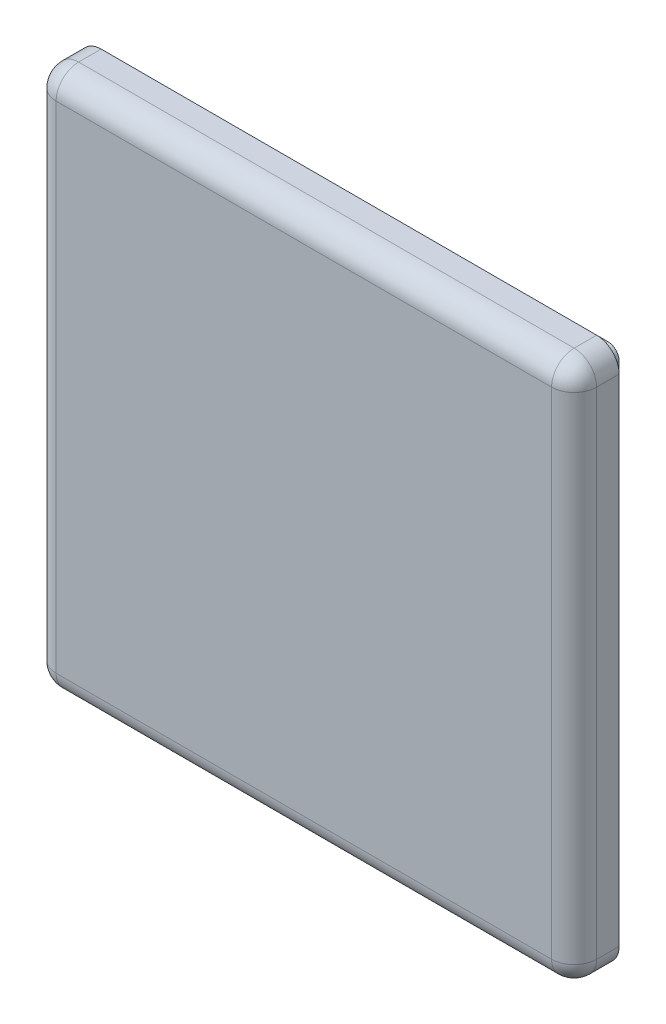
ISO-10303-21;
HEADER;
FILE_DESCRIPTION(('STEP AP214'),'2;1');
FILE_NAME('part.step','',(''),(''),'','','');
FILE_SCHEMA(('AUTOMOTIVE_DESIGN { 1 0 10303 214 1 1 1 1 }'));
ENDSEC;
DATA;
#1=APPLICATION_CONTEXT('core data for automotive mechanical design processes');
#2=APPLICATION_PROTOCOL_DEFINITION('international standard','automotive_design',2000,#1);
#3=PRODUCT_CONTEXT('',#1,'mechanical');
#4=PRODUCT('Part','Part','',(#3));
#5=PRODUCT_RELATED_PRODUCT_CATEGORY('part','',(#4));
#6=PRODUCT_DEFINITION_FORMATION('','',#4);
#7=PRODUCT_DEFINITION_CONTEXT('part definition',#1,'design');
#8=PRODUCT_DEFINITION('design','',#6,#7);
#9=PRODUCT_DEFINITION_SHAPE('','',#8);
#10=(LENGTH_UNIT() NAMED_UNIT(*) SI_UNIT(.MILLI.,.METRE.));
#11=(NAMED_UNIT(*) PLANE_ANGLE_UNIT() SI_UNIT($,.RADIAN.));
#12=(NAMED_UNIT(*) SI_UNIT($,.STERADIAN.) SOLID_ANGLE_UNIT());
#13=UNCERTAINTY_MEASURE_WITH_UNIT(LENGTH_MEASURE(1.E-05),#10,'distance_accuracy_value','');
#14=(GEOMETRIC_REPRESENTATION_CONTEXT(3) GLOBAL_UNCERTAINTY_ASSIGNED_CONTEXT((#13)) GLOBAL_UNIT_ASSIGNED_CONTEXT((#10,
#11,#12)) REPRESENTATION_CONTEXT('',''));
#15=CARTESIAN_POINT('',(0.,0.,0.));
#16=DIRECTION('',(0.,0.,1.));
#17=DIRECTION('',(1.,0.,0.));
#18=AXIS2_PLACEMENT_3D('',#15,#16,#17);
#19=CARTESIAN_POINT('',(0.,0.,0.));
#20=DIRECTION('',(0.,0.,-1.));
#21=DIRECTION('',(-1.,0.,0.));
#22=AXIS2_PLACEMENT_3D('',#19,#20,#21);
#23=PLANE('',#22);
#24=DIRECTION('',(-1.,0.,0.));
#25=VECTOR('',#24,1.);
#26=CARTESIAN_POINT('',(-12.,12.,0.));
#27=LINE('',#26,#25);
#28=CARTESIAN_POINT('',(11.,12.,0.));
#29=VERTEX_POINT('',#28);
#30=CARTESIAN_POINT('',(-11.,12.,0.));
#31=VERTEX_POINT('',#30);
#32=EDGE_CURVE('E254',#29,#31,#27,.T.);
#33=ORIENTED_EDGE('',*,*,#32,.F.);
#34=CARTESIAN_POINT('',(11.,11.,0.));
#35=DIRECTION('',(0.,0.,-1.));
#36=DIRECTION('',(-1.,0.,0.));
#37=AXIS2_PLACEMENT_3D('',#34,#35,#36);
#38=CIRCLE('',#37,1.);
#39=CARTESIAN_POINT('',(12.,11.,0.));
#40=VERTEX_POINT('',#39);
#41=EDGE_CURVE('E317',#29,#40,#38,.T.);
#42=ORIENTED_EDGE('',*,*,#41,.T.);
#43=DIRECTION('',(0.,1.,0.));
#44=VECTOR('',#43,1.);
#45=CARTESIAN_POINT('',(12.,-12.,0.));
#46=LINE('',#45,#44);
#47=CARTESIAN_POINT('',(12.,-11.,0.));
#48=VERTEX_POINT('',#47);
#49=EDGE_CURVE('E242',#48,#40,#46,.T.);
#50=ORIENTED_EDGE('',*,*,#49,.F.);
#51=CARTESIAN_POINT('',(11.,-11.,0.));
#52=DIRECTION('',(0.,0.,-1.));
#53=DIRECTION('',(-1.,0.,0.));
#54=AXIS2_PLACEMENT_3D('',#51,#52,#53);
#55=CIRCLE('',#54,1.);
#56=CARTESIAN_POINT('',(11.,-12.,0.));
#57=VERTEX_POINT('',#56);
#58=EDGE_CURVE('E315',#48,#57,#55,.T.);
#59=ORIENTED_EDGE('',*,*,#58,.T.);
#60=DIRECTION('',(1.,0.,0.));
#61=VECTOR('',#60,1.);
#62=CARTESIAN_POINT('',(-12.,-12.,0.));
#63=LINE('',#62,#61);
#64=CARTESIAN_POINT('',(-11.,-12.,0.));
#65=VERTEX_POINT('',#64);
#66=EDGE_CURVE('E260',#65,#57,#63,.T.);
#67=ORIENTED_EDGE('',*,*,#66,.F.);
#68=CARTESIAN_POINT('',(-11.,-11.,0.));
#69=DIRECTION('',(0.,0.,-1.));
#70=DIRECTION('',(-1.,0.,0.));
#71=AXIS2_PLACEMENT_3D('',#68,#69,#70);
#72=CIRCLE('',#71,1.);
#73=CARTESIAN_POINT('',(-12.,-11.,0.));
#74=VERTEX_POINT('',#73);
#75=EDGE_CURVE('E313',#65,#74,#72,.T.);
#76=ORIENTED_EDGE('',*,*,#75,.T.);
#77=DIRECTION('',(0.,-1.,0.));
#78=VECTOR('',#77,1.);
#79=CARTESIAN_POINT('',(-12.,-12.,0.));
#80=LINE('',#79,#78);
#81=CARTESIAN_POINT('',(-12.,11.,0.));
#82=VERTEX_POINT('',#81);
#83=EDGE_CURVE('E257',#82,#74,#80,.T.);
#84=ORIENTED_EDGE('',*,*,#83,.F.);
#85=CARTESIAN_POINT('',(-11.,11.,0.));
#86=DIRECTION('',(0.,0.,-1.));
#87=DIRECTION('',(-1.,0.,0.));
#88=AXIS2_PLACEMENT_3D('',#85,#86,#87);
#89=CIRCLE('',#88,1.);
#90=EDGE_CURVE('E311',#82,#31,#89,.T.);
#91=ORIENTED_EDGE('',*,*,#90,.T.);
#92=EDGE_LOOP('',(#33,#42,#50,#59,#67,#76,#84,#91));
#93=FACE_BOUND('',#92,.T.);
#94=DIRECTION('',(1.,0.,0.));
#95=VECTOR('',#94,1.);
#96=CARTESIAN_POINT('',(11.,11.,0.));
#97=LINE('',#96,#95);
#98=CARTESIAN_POINT('',(-10.5,11.,0.));
#99=VERTEX_POINT('',#98);
#100=CARTESIAN_POINT('',(10.5,11.,0.));
#101=VERTEX_POINT('',#100);
#102=EDGE_CURVE('E245',#99,#101,#97,.T.);
#103=ORIENTED_EDGE('',*,*,#102,.F.);
#104=CARTESIAN_POINT('',(-10.5,10.5,0.));
#105=DIRECTION('',(0.,0.,-1.));
#106=DIRECTION('',(-1.,0.,0.));
#107=AXIS2_PLACEMENT_3D('',#104,#105,#106);
#108=CIRCLE('',#107,0.5);
#109=CARTESIAN_POINT('',(-11.,10.5,0.));
#110=VERTEX_POINT('',#109);
#111=EDGE_CURVE('E369',#99,#110,#108,.F.);
#112=ORIENTED_EDGE('',*,*,#111,.T.);
#113=DIRECTION('',(0.,1.,0.));
#114=VECTOR('',#113,1.);
#115=CARTESIAN_POINT('',(-11.,11.,0.));
#116=LINE('',#115,#114);
#117=CARTESIAN_POINT('',(-11.,-10.5,0.));
#118=VERTEX_POINT('',#117);
#119=EDGE_CURVE('E205',#118,#110,#116,.T.);
#120=ORIENTED_EDGE('',*,*,#119,.F.);
#121=CARTESIAN_POINT('',(-10.5,-10.5,0.));
#122=DIRECTION('',(0.,0.,-1.));
#123=DIRECTION('',(-1.,0.,0.));
#124=AXIS2_PLACEMENT_3D('',#121,#122,#123);
#125=CIRCLE('',#124,0.5);
#126=CARTESIAN_POINT('',(-10.5,-11.,0.));
#127=VERTEX_POINT('',#126);
#128=EDGE_CURVE('E367',#118,#127,#125,.F.);
#129=ORIENTED_EDGE('',*,*,#128,.T.);
#130=DIRECTION('',(-1.,0.,0.));
#131=VECTOR('',#130,1.);
#132=CARTESIAN_POINT('',(11.,-11.,0.));
#133=LINE('',#132,#131);
#134=CARTESIAN_POINT('',(10.5,-11.,0.));
#135=VERTEX_POINT('',#134);
#136=EDGE_CURVE('E233',#135,#127,#133,.T.);
#137=ORIENTED_EDGE('',*,*,#136,.F.);
#138=CARTESIAN_POINT('',(10.5,-10.5,0.));
#139=DIRECTION('',(0.,0.,-1.));
#140=DIRECTION('',(-1.,0.,0.));
#141=AXIS2_PLACEMENT_3D('',#138,#139,#140);
#142=CIRCLE('',#141,0.5);
#143=CARTESIAN_POINT('',(11.,-10.5,0.));
#144=VERTEX_POINT('',#143);
#145=EDGE_CURVE('E11',#135,#144,#142,.F.);
#146=ORIENTED_EDGE('',*,*,#145,.T.);
#147=DIRECTION('',(0.,-1.,0.));
#148=VECTOR('',#147,1.);
#149=CARTESIAN_POINT('',(11.,11.,0.));
#150=LINE('',#149,#148);
#151=CARTESIAN_POINT('',(11.,10.5,0.));
#152=VERTEX_POINT('',#151);
#153=EDGE_CURVE('E248',#152,#144,#150,.T.);
#154=ORIENTED_EDGE('',*,*,#153,.F.);
#155=CARTESIAN_POINT('',(10.5,10.5,0.));
#156=DIRECTION('',(0.,0.,-1.));
#157=DIRECTION('',(-1.,0.,0.));
#158=AXIS2_PLACEMENT_3D('',#155,#156,#157);
#159=CIRCLE('',#158,0.5);
#160=EDGE_CURVE('E45',#152,#101,#159,.F.);
#161=ORIENTED_EDGE('',*,*,#160,.T.);
#162=EDGE_LOOP('',(#103,#112,#120,#129,#137,#146,#154,#161));
#163=FACE_BOUND('',#162,.T.);
#164=ADVANCED_FACE('F37',(#93,#163),#23,.T.);
#165=CARTESIAN_POINT('',(12.,-12.,2.));
#166=DIRECTION('',(-1.,0.,0.));
#167=DIRECTION('',(0.,0.,1.));
#168=AXIS2_PLACEMENT_3D('',#165,#166,#167);
#169=PLANE('',#168);
#170=ORIENTED_EDGE('',*,*,#49,.T.);
#171=DIRECTION('',(0.,0.,-1.));
#172=VECTOR('',#171,1.);
#173=CARTESIAN_POINT('',(12.,11.,2.));
#174=LINE('',#173,#172);
#175=CARTESIAN_POINT('',(12.,11.,1.));
#176=VERTEX_POINT('',#175);
#177=EDGE_CURVE('E321',#40,#176,#174,.F.);
#178=ORIENTED_EDGE('',*,*,#177,.T.);
#179=DIRECTION('',(0.,1.,0.));
#180=VECTOR('',#179,1.);
#181=CARTESIAN_POINT('',(12.,-12.,1.));
#182=LINE('',#181,#180);
#183=CARTESIAN_POINT('',(12.,-11.,1.));
#184=VERTEX_POINT('',#183);
#185=EDGE_CURVE('E275',#176,#184,#182,.F.);
#186=ORIENTED_EDGE('',*,*,#185,.T.);
#187=DIRECTION('',(0.,0.,-1.));
#188=VECTOR('',#187,1.);
#189=CARTESIAN_POINT('',(12.,-11.,2.));
#190=LINE('',#189,#188);
#191=EDGE_CURVE('E319',#184,#48,#190,.T.);
#192=ORIENTED_EDGE('',*,*,#191,.T.);
#193=EDGE_LOOP('',(#170,#178,#186,#192));
#194=FACE_BOUND('',#193,.T.);
#195=ADVANCED_FACE('F410',(#194),#169,.F.);
#196=CARTESIAN_POINT('',(-12.,12.,2.));
#197=DIRECTION('',(0.,-1.,0.));
#198=DIRECTION('',(0.,0.,-1.));
#199=AXIS2_PLACEMENT_3D('',#196,#197,#198);
#200=PLANE('',#199);
#201=DIRECTION('',(-1.,0.,0.));
#202=VECTOR('',#201,1.);
#203=CARTESIAN_POINT('',(-12.,12.,1.));
#204=LINE('',#203,#202);
#205=CARTESIAN_POINT('',(-11.,12.,1.));
#206=VERTEX_POINT('',#205);
#207=CARTESIAN_POINT('',(11.,12.,1.));
#208=VERTEX_POINT('',#207);
#209=EDGE_CURVE('E284',#206,#208,#204,.F.);
#210=ORIENTED_EDGE('',*,*,#209,.T.);
#211=DIRECTION('',(0.,0.,-1.));
#212=VECTOR('',#211,1.);
#213=CARTESIAN_POINT('',(11.,12.,2.));
#214=LINE('',#213,#212);
#215=EDGE_CURVE('E309',#208,#29,#214,.T.);
#216=ORIENTED_EDGE('',*,*,#215,.T.);
#217=ORIENTED_EDGE('',*,*,#32,.T.);
#218=DIRECTION('',(0.,0.,-1.));
#219=VECTOR('',#218,1.);
#220=CARTESIAN_POINT('',(-11.,12.,2.));
#221=LINE('',#220,#219);
#222=EDGE_CURVE('E307',#31,#206,#221,.F.);
#223=ORIENTED_EDGE('',*,*,#222,.T.);
#224=EDGE_LOOP('',(#210,#216,#217,#223));
#225=FACE_BOUND('',#224,.T.);
#226=ADVANCED_FACE('F417',(#225),#200,.F.);
#227=CARTESIAN_POINT('',(-12.,-12.,2.));
#228=DIRECTION('',(1.,0.,0.));
#229=DIRECTION('',(0.,0.,-1.));
#230=AXIS2_PLACEMENT_3D('',#227,#228,#229);
#231=PLANE('',#230);
#232=ORIENTED_EDGE('',*,*,#83,.T.);
#233=DIRECTION('',(0.,0.,-1.));
#234=VECTOR('',#233,1.);
#235=CARTESIAN_POINT('',(-12.,-11.,2.));
#236=LINE('',#235,#234);
#237=CARTESIAN_POINT('',(-12.,-11.,1.));
#238=VERTEX_POINT('',#237);
#239=EDGE_CURVE('E329',#74,#238,#236,.F.);
#240=ORIENTED_EDGE('',*,*,#239,.T.);
#241=DIRECTION('',(0.,-1.,0.));
#242=VECTOR('',#241,1.);
#243=CARTESIAN_POINT('',(-12.,-12.,1.));
#244=LINE('',#243,#242);
#245=CARTESIAN_POINT('',(-12.,11.,1.));
#246=VERTEX_POINT('',#245);
#247=EDGE_CURVE('E281',#238,#246,#244,.F.);
#248=ORIENTED_EDGE('',*,*,#247,.T.);
#249=DIRECTION('',(0.,0.,-1.));
#250=VECTOR('',#249,1.);
#251=CARTESIAN_POINT('',(-12.,11.,2.));
#252=LINE('',#251,#250);
#253=EDGE_CURVE('E327',#246,#82,#252,.T.);
#254=ORIENTED_EDGE('',*,*,#253,.T.);
#255=EDGE_LOOP('',(#232,#240,#248,#254));
#256=FACE_BOUND('',#255,.T.);
#257=ADVANCED_FACE('F465',(#256),#231,.F.);
#258=CARTESIAN_POINT('',(-12.,-12.,2.));
#259=DIRECTION('',(0.,1.,0.));
#260=DIRECTION('',(0.,0.,1.));
#261=AXIS2_PLACEMENT_3D('',#258,#259,#260);
#262=PLANE('',#261);
#263=ORIENTED_EDGE('',*,*,#66,.T.);
#264=DIRECTION('',(0.,0.,-1.));
#265=VECTOR('',#264,1.);
#266=CARTESIAN_POINT('',(11.,-12.,2.));
#267=LINE('',#266,#265);
#268=CARTESIAN_POINT('',(11.,-12.,1.));
#269=VERTEX_POINT('',#268);
#270=EDGE_CURVE('E325',#57,#269,#267,.F.);
#271=ORIENTED_EDGE('',*,*,#270,.T.);
#272=DIRECTION('',(1.,0.,0.));
#273=VECTOR('',#272,1.);
#274=CARTESIAN_POINT('',(-12.,-12.,1.));
#275=LINE('',#274,#273);
#276=CARTESIAN_POINT('',(-11.,-12.,1.));
#277=VERTEX_POINT('',#276);
#278=EDGE_CURVE('E278',#269,#277,#275,.F.);
#279=ORIENTED_EDGE('',*,*,#278,.T.);
#280=DIRECTION('',(0.,0.,-1.));
#281=VECTOR('',#280,1.);
#282=CARTESIAN_POINT('',(-11.,-12.,2.));
#283=LINE('',#282,#281);
#284=EDGE_CURVE('E323',#277,#65,#283,.T.);
#285=ORIENTED_EDGE('',*,*,#284,.T.);
#286=EDGE_LOOP('',(#263,#271,#279,#285));
#287=FACE_BOUND('',#286,.T.);
#288=ADVANCED_FACE('F460',(#287),#262,.F.);
#289=CARTESIAN_POINT('',(0.,0.,2.));
#290=DIRECTION('',(0.,0.,-1.));
#291=DIRECTION('',(-1.,0.,0.));
#292=AXIS2_PLACEMENT_3D('',#289,#290,#291);
#293=PLANE('',#292);
#294=DIRECTION('',(1.,0.,0.));
#295=VECTOR('',#294,1.);
#296=CARTESIAN_POINT('',(0.,-11.,2.));
#297=LINE('',#296,#295);
#298=CARTESIAN_POINT('',(-11.,-11.,2.));
#299=VERTEX_POINT('',#298);
#300=CARTESIAN_POINT('',(11.,-11.,2.));
#301=VERTEX_POINT('',#300);
#302=EDGE_CURVE('E269',#299,#301,#297,.T.);
#303=ORIENTED_EDGE('',*,*,#302,.T.);
#304=DIRECTION('',(0.,1.,0.));
#305=VECTOR('',#304,1.);
#306=CARTESIAN_POINT('',(11.,0.,2.));
#307=LINE('',#306,#305);
#308=CARTESIAN_POINT('',(11.,11.,2.));
#309=VERTEX_POINT('',#308);
#310=EDGE_CURVE('E272',#301,#309,#307,.T.);
#311=ORIENTED_EDGE('',*,*,#310,.T.);
#312=DIRECTION('',(-1.,0.,0.));
#313=VECTOR('',#312,1.);
#314=CARTESIAN_POINT('',(0.,11.,2.));
#315=LINE('',#314,#313);
#316=CARTESIAN_POINT('',(-11.,11.,2.));
#317=VERTEX_POINT('',#316);
#318=EDGE_CURVE('E263',#309,#317,#315,.T.);
#319=ORIENTED_EDGE('',*,*,#318,.T.);
#320=DIRECTION('',(0.,-1.,0.));
#321=VECTOR('',#320,1.);
#322=CARTESIAN_POINT('',(-11.,0.,2.));
#323=LINE('',#322,#321);
#324=EDGE_CURVE('E266',#317,#299,#323,.T.);
#325=ORIENTED_EDGE('',*,*,#324,.T.);
#326=EDGE_LOOP('',(#303,#311,#319,#325));
#327=FACE_BOUND('',#326,.T.);
#328=ADVANCED_FACE('F451',(#327),#293,.F.);
#329=CARTESIAN_POINT('',(0.,0.,-1.));
#330=DIRECTION('',(0.,0.,-1.));
#331=DIRECTION('',(-1.,0.,0.));
#332=AXIS2_PLACEMENT_3D('',#329,#330,#331);
#333=PLANE('',#332);
#334=DIRECTION('',(-1.,0.,0.));
#335=VECTOR('',#334,1.);
#336=CARTESIAN_POINT('',(11.,-11.,-1.));
#337=LINE('',#336,#335);
#338=CARTESIAN_POINT('',(10.5,-11.,-1.));
#339=VERTEX_POINT('',#338);
#340=CARTESIAN_POINT('',(-10.5,-11.,-1.));
#341=VERTEX_POINT('',#340);
#342=EDGE_CURVE('E239',#339,#341,#337,.T.);
#343=ORIENTED_EDGE('',*,*,#342,.T.);
#344=CARTESIAN_POINT('',(-10.5,-10.5,-1.));
#345=DIRECTION('',(0.,0.,-1.));
#346=DIRECTION('',(-1.,0.,0.));
#347=AXIS2_PLACEMENT_3D('',#344,#345,#346);
#348=CIRCLE('',#347,0.5);
#349=CARTESIAN_POINT('',(-11.,-10.5,-1.));
#350=VERTEX_POINT('',#349);
#351=EDGE_CURVE('E356',#341,#350,#348,.T.);
#352=ORIENTED_EDGE('',*,*,#351,.T.);
#353=DIRECTION('',(0.,1.,0.));
#354=VECTOR('',#353,1.);
#355=CARTESIAN_POINT('',(-11.,11.,-1.));
#356=LINE('',#355,#354);
#357=CARTESIAN_POINT('',(-11.,10.5,-1.));
#358=VERTEX_POINT('',#357);
#359=EDGE_CURVE('E229',#350,#358,#356,.T.);
#360=ORIENTED_EDGE('',*,*,#359,.T.);
#361=CARTESIAN_POINT('',(-10.5,10.5,-1.));
#362=DIRECTION('',(0.,0.,-1.));
#363=DIRECTION('',(-1.,0.,0.));
#364=AXIS2_PLACEMENT_3D('',#361,#362,#363);
#365=CIRCLE('',#364,0.5);
#366=CARTESIAN_POINT('',(-10.5,11.,-1.));
#367=VERTEX_POINT('',#366);
#368=EDGE_CURVE('E354',#358,#367,#365,.T.);
#369=ORIENTED_EDGE('',*,*,#368,.T.);
#370=DIRECTION('',(1.,0.,0.));
#371=VECTOR('',#370,1.);
#372=CARTESIAN_POINT('',(11.,11.,-1.));
#373=LINE('',#372,#371);
#374=CARTESIAN_POINT('',(10.5,11.,-1.));
#375=VERTEX_POINT('',#374);
#376=EDGE_CURVE('E232',#367,#375,#373,.T.);
#377=ORIENTED_EDGE('',*,*,#376,.T.);
#378=CARTESIAN_POINT('',(10.5,10.5,-1.));
#379=DIRECTION('',(0.,0.,-1.));
#380=DIRECTION('',(-1.,0.,0.));
#381=AXIS2_PLACEMENT_3D('',#378,#379,#380);
#382=CIRCLE('',#381,0.5);
#383=CARTESIAN_POINT('',(11.,10.5,-1.));
#384=VERTEX_POINT('',#383);
#385=EDGE_CURVE('E352',#375,#384,#382,.T.);
#386=ORIENTED_EDGE('',*,*,#385,.T.);
#387=DIRECTION('',(0.,-1.,0.));
#388=VECTOR('',#387,1.);
#389=CARTESIAN_POINT('',(11.,11.,-1.));
#390=LINE('',#389,#388);
#391=CARTESIAN_POINT('',(11.,-10.5,-1.));
#392=VERTEX_POINT('',#391);
#393=EDGE_CURVE('E236',#384,#392,#390,.T.);
#394=ORIENTED_EDGE('',*,*,#393,.T.);
#395=CARTESIAN_POINT('',(10.5,-10.5,-1.));
#396=DIRECTION('',(0.,0.,-1.));
#397=DIRECTION('',(-1.,0.,0.));
#398=AXIS2_PLACEMENT_3D('',#395,#396,#397);
#399=CIRCLE('',#398,0.5);
#400=EDGE_CURVE('E350',#392,#339,#399,.T.);
#401=ORIENTED_EDGE('',*,*,#400,.T.);
#402=EDGE_LOOP('',(#343,#352,#360,#369,#377,#386,#394,#401));
#403=FACE_BOUND('',#402,.T.);
#404=DIRECTION('',(1.,0.,0.));
#405=VECTOR('',#404,1.);
#406=CARTESIAN_POINT('',(10.,10.,-1.));
#407=LINE('',#406,#405);
#408=CARTESIAN_POINT('',(-10.,10.,-1.));
#409=VERTEX_POINT('',#408);
#410=CARTESIAN_POINT('',(10.,10.,-1.));
#411=VERTEX_POINT('',#410);
#412=EDGE_CURVE('E196',#409,#411,#407,.T.);
#413=ORIENTED_EDGE('',*,*,#412,.F.);
#414=DIRECTION('',(0.,1.,0.));
#415=VECTOR('',#414,1.);
#416=CARTESIAN_POINT('',(-10.,10.,-1.));
#417=LINE('',#416,#415);
#418=CARTESIAN_POINT('',(-10.,-10.,-1.));
#419=VERTEX_POINT('',#418);
#420=EDGE_CURVE('E186',#419,#409,#417,.T.);
#421=ORIENTED_EDGE('',*,*,#420,.F.);
#422=DIRECTION('',(-1.,0.,0.));
#423=VECTOR('',#422,1.);
#424=CARTESIAN_POINT('',(10.,-10.,-1.));
#425=LINE('',#424,#423);
#426=CARTESIAN_POINT('',(10.,-10.,-1.));
#427=VERTEX_POINT('',#426);
#428=EDGE_CURVE('E213',#427,#419,#425,.T.);
#429=ORIENTED_EDGE('',*,*,#428,.F.);
#430=DIRECTION('',(0.,-1.,0.));
#431=VECTOR('',#430,1.);
#432=CARTESIAN_POINT('',(10.,10.,-1.));
#433=LINE('',#432,#431);
#434=EDGE_CURVE('E211',#411,#427,#433,.T.);
#435=ORIENTED_EDGE('',*,*,#434,.F.);
#436=EDGE_LOOP('',(#413,#421,#429,#435));
#437=FACE_BOUND('',#436,.T.);
#438=ADVANCED_FACE('F209',(#403,#437),#333,.T.);
#439=CARTESIAN_POINT('',(-11.,11.,-1.));
#440=DIRECTION('',(1.,0.,0.));
#441=DIRECTION('',(0.,1.,0.));
#442=AXIS2_PLACEMENT_3D('',#439,#440,#441);
#443=PLANE('',#442);
#444=ORIENTED_EDGE('',*,*,#359,.F.);
#445=DIRECTION('',(0.,0.,1.));
#446=VECTOR('',#445,1.);
#447=CARTESIAN_POINT('',(-11.,-10.5,-1.));
#448=LINE('',#447,#446);
#449=EDGE_CURVE('E342',#350,#118,#448,.T.);
#450=ORIENTED_EDGE('',*,*,#449,.T.);
#451=ORIENTED_EDGE('',*,*,#119,.T.);
#452=DIRECTION('',(0.,0.,1.));
#453=VECTOR('',#452,1.);
#454=CARTESIAN_POINT('',(-11.,10.5,-1.));
#455=LINE('',#454,#453);
#456=EDGE_CURVE('E331',#110,#358,#455,.F.);
#457=ORIENTED_EDGE('',*,*,#456,.T.);
#458=EDGE_LOOP('',(#444,#450,#451,#457));
#459=FACE_BOUND('',#458,.T.);
#460=ADVANCED_FACE('F396',(#459),#443,.F.);
#461=CARTESIAN_POINT('',(11.,11.,-1.));
#462=DIRECTION('',(0.,-1.,0.));
#463=DIRECTION('',(0.,0.,-1.));
#464=AXIS2_PLACEMENT_3D('',#461,#462,#463);
#465=PLANE('',#464);
#466=ORIENTED_EDGE('',*,*,#376,.F.);
#467=DIRECTION('',(0.,0.,1.));
#468=VECTOR('',#467,1.);
#469=CARTESIAN_POINT('',(-10.5,11.,-1.));
#470=LINE('',#469,#468);
#471=EDGE_CURVE('E360',#367,#99,#470,.T.);
#472=ORIENTED_EDGE('',*,*,#471,.T.);
#473=ORIENTED_EDGE('',*,*,#102,.T.);
#474=DIRECTION('',(0.,0.,1.));
#475=VECTOR('',#474,1.);
#476=CARTESIAN_POINT('',(10.5,11.,-1.));
#477=LINE('',#476,#475);
#478=EDGE_CURVE('E358',#101,#375,#477,.F.);
#479=ORIENTED_EDGE('',*,*,#478,.T.);
#480=EDGE_LOOP('',(#466,#472,#473,#479));
#481=FACE_BOUND('',#480,.T.);
#482=ADVANCED_FACE('F373',(#481),#465,.F.);
#483=CARTESIAN_POINT('',(11.,11.,-1.));
#484=DIRECTION('',(-1.,0.,0.));
#485=DIRECTION('',(0.,-1.,0.));
#486=AXIS2_PLACEMENT_3D('',#483,#484,#485);
#487=PLANE('',#486);
#488=ORIENTED_EDGE('',*,*,#393,.F.);
#489=DIRECTION('',(0.,0.,1.));
#490=VECTOR('',#489,1.);
#491=CARTESIAN_POINT('',(11.,10.5,-1.));
#492=LINE('',#491,#490);
#493=EDGE_CURVE('E365',#384,#152,#492,.T.);
#494=ORIENTED_EDGE('',*,*,#493,.T.);
#495=ORIENTED_EDGE('',*,*,#153,.T.);
#496=DIRECTION('',(0.,0.,1.));
#497=VECTOR('',#496,1.);
#498=CARTESIAN_POINT('',(11.,-10.5,-1.));
#499=LINE('',#498,#497);
#500=EDGE_CURVE('E363',#144,#392,#499,.F.);
#501=ORIENTED_EDGE('',*,*,#500,.T.);
#502=EDGE_LOOP('',(#488,#494,#495,#501));
#503=FACE_BOUND('',#502,.T.);
#504=ADVANCED_FACE('F381',(#503),#487,.F.);
#505=CARTESIAN_POINT('',(11.,-11.,-1.));
#506=DIRECTION('',(0.,1.,0.));
#507=DIRECTION('',(0.,0.,1.));
#508=AXIS2_PLACEMENT_3D('',#505,#506,#507);
#509=PLANE('',#508);
#510=ORIENTED_EDGE('',*,*,#136,.T.);
#511=DIRECTION('',(0.,0.,1.));
#512=VECTOR('',#511,1.);
#513=CARTESIAN_POINT('',(-10.5,-11.,-1.));
#514=LINE('',#513,#512);
#515=EDGE_CURVE('E348',#127,#341,#514,.F.);
#516=ORIENTED_EDGE('',*,*,#515,.T.);
#517=ORIENTED_EDGE('',*,*,#342,.F.);
#518=DIRECTION('',(0.,0.,1.));
#519=VECTOR('',#518,1.);
#520=CARTESIAN_POINT('',(10.5,-11.,-1.));
#521=LINE('',#520,#519);
#522=EDGE_CURVE('E345',#339,#135,#521,.T.);
#523=ORIENTED_EDGE('',*,*,#522,.T.);
#524=EDGE_LOOP('',(#510,#516,#517,#523));
#525=FACE_BOUND('',#524,.T.);
#526=ADVANCED_FACE('F388',(#525),#509,.F.);
#527=CARTESIAN_POINT('',(-10.,10.,-1.));
#528=DIRECTION('',(1.,0.,0.));
#529=DIRECTION('',(0.,1.,0.));
#530=AXIS2_PLACEMENT_3D('',#527,#528,#529);
#531=PLANE('',#530);
#532=DIRECTION('',(0.,1.,0.));
#533=VECTOR('',#532,1.);
#534=CARTESIAN_POINT('',(-10.,10.,0.));
#535=LINE('',#534,#533);
#536=CARTESIAN_POINT('',(-10.,-10.,0.));
#537=VERTEX_POINT('',#536);
#538=CARTESIAN_POINT('',(-10.,10.,0.));
#539=VERTEX_POINT('',#538);
#540=EDGE_CURVE('E217',#537,#539,#535,.T.);
#541=ORIENTED_EDGE('',*,*,#540,.F.);
#542=DIRECTION('',(0.,0.,1.));
#543=VECTOR('',#542,1.);
#544=CARTESIAN_POINT('',(-10.,-10.,-1.));
#545=LINE('',#544,#543);
#546=EDGE_CURVE('E192',#419,#537,#545,.T.);
#547=ORIENTED_EDGE('',*,*,#546,.F.);
#548=ORIENTED_EDGE('',*,*,#420,.T.);
#549=DIRECTION('',(0.,0.,1.));
#550=VECTOR('',#549,1.);
#551=CARTESIAN_POINT('',(-10.,10.,-1.));
#552=LINE('',#551,#550);
#553=EDGE_CURVE('E190',#409,#539,#552,.T.);
#554=ORIENTED_EDGE('',*,*,#553,.T.);
#555=EDGE_LOOP('',(#541,#547,#548,#554));
#556=FACE_BOUND('',#555,.T.);
#557=ADVANCED_FACE('F189',(#556),#531,.T.);
#558=CARTESIAN_POINT('',(10.,10.,-1.));
#559=DIRECTION('',(0.,-1.,0.));
#560=DIRECTION('',(0.,0.,-1.));
#561=AXIS2_PLACEMENT_3D('',#558,#559,#560);
#562=PLANE('',#561);
#563=DIRECTION('',(1.,0.,0.));
#564=VECTOR('',#563,1.);
#565=CARTESIAN_POINT('',(10.,10.,0.));
#566=LINE('',#565,#564);
#567=CARTESIAN_POINT('',(10.,10.,0.));
#568=VERTEX_POINT('',#567);
#569=EDGE_CURVE('E204',#539,#568,#566,.T.);
#570=ORIENTED_EDGE('',*,*,#569,.F.);
#571=ORIENTED_EDGE('',*,*,#553,.F.);
#572=ORIENTED_EDGE('',*,*,#412,.T.);
#573=DIRECTION('',(0.,0.,1.));
#574=VECTOR('',#573,1.);
#575=CARTESIAN_POINT('',(10.,10.,-1.));
#576=LINE('',#575,#574);
#577=EDGE_CURVE('E206',#411,#568,#576,.T.);
#578=ORIENTED_EDGE('',*,*,#577,.T.);
#579=EDGE_LOOP('',(#570,#571,#572,#578));
#580=FACE_BOUND('',#579,.T.);
#581=ADVANCED_FACE('F201',(#580),#562,.T.);
#582=CARTESIAN_POINT('',(10.,10.,-1.));
#583=DIRECTION('',(-1.,0.,0.));
#584=DIRECTION('',(0.,-1.,0.));
#585=AXIS2_PLACEMENT_3D('',#582,#583,#584);
#586=PLANE('',#585);
#587=DIRECTION('',(0.,-1.,0.));
#588=VECTOR('',#587,1.);
#589=CARTESIAN_POINT('',(10.,10.,0.));
#590=LINE('',#589,#588);
#591=CARTESIAN_POINT('',(10.,-10.,0.));
#592=VERTEX_POINT('',#591);
#593=EDGE_CURVE('E221',#568,#592,#590,.T.);
#594=ORIENTED_EDGE('',*,*,#593,.F.);
#595=ORIENTED_EDGE('',*,*,#577,.F.);
#596=ORIENTED_EDGE('',*,*,#434,.T.);
#597=DIRECTION('',(0.,0.,1.));
#598=VECTOR('',#597,1.);
#599=CARTESIAN_POINT('',(10.,-10.,-1.));
#600=LINE('',#599,#598);
#601=EDGE_CURVE('E225',#427,#592,#600,.T.);
#602=ORIENTED_EDGE('',*,*,#601,.T.);
#603=EDGE_LOOP('',(#594,#595,#596,#602));
#604=FACE_BOUND('',#603,.T.);
#605=ADVANCED_FACE('F434',(#604),#586,.T.);
#606=CARTESIAN_POINT('',(10.,-10.,-1.));
#607=DIRECTION('',(0.,1.,0.));
#608=DIRECTION('',(0.,0.,1.));
#609=AXIS2_PLACEMENT_3D('',#606,#607,#608);
#610=PLANE('',#609);
#611=DIRECTION('',(-1.,0.,0.));
#612=VECTOR('',#611,1.);
#613=CARTESIAN_POINT('',(10.,-10.,0.));
#614=LINE('',#613,#612);
#615=EDGE_CURVE('E197',#592,#537,#614,.T.);
#616=ORIENTED_EDGE('',*,*,#615,.F.);
#617=ORIENTED_EDGE('',*,*,#601,.F.);
#618=ORIENTED_EDGE('',*,*,#428,.T.);
#619=ORIENTED_EDGE('',*,*,#546,.T.);
#620=EDGE_LOOP('',(#616,#617,#618,#619));
#621=FACE_BOUND('',#620,.T.);
#622=ADVANCED_FACE('F425',(#621),#610,.T.);
#623=ORIENTED_EDGE('',*,*,#540,.T.);
#624=ORIENTED_EDGE('',*,*,#569,.T.);
#625=ORIENTED_EDGE('',*,*,#593,.T.);
#626=ORIENTED_EDGE('',*,*,#615,.T.);
#627=EDGE_LOOP('',(#623,#624,#625,#626));
#628=FACE_BOUND('',#627,.T.);
#629=ADVANCED_FACE('F413',(#628),#23,.T.);
#630=CARTESIAN_POINT('',(-11.,0.,1.));
#631=DIRECTION('',(0.,-1.,0.));
#632=DIRECTION('',(0.,0.,-1.));
#633=AXIS2_PLACEMENT_3D('',#630,#631,#632);
#634=CYLINDRICAL_SURFACE('',#633,1.);
#635=ORIENTED_EDGE('',*,*,#247,.F.);
#636=CARTESIAN_POINT('',(-11.,-11.,1.));
#637=DIRECTION('',(0.,-1.,0.));
#638=DIRECTION('',(0.,0.,-1.));
#639=AXIS2_PLACEMENT_3D('',#636,#637,#638);
#640=CIRCLE('',#639,1.);
#641=EDGE_CURVE('E305',#238,#299,#640,.F.);
#642=ORIENTED_EDGE('',*,*,#641,.T.);
#643=ORIENTED_EDGE('',*,*,#324,.F.);
#644=CARTESIAN_POINT('',(-11.,11.,1.));
#645=DIRECTION('',(0.,-1.,0.));
#646=DIRECTION('',(0.,0.,-1.));
#647=AXIS2_PLACEMENT_3D('',#644,#645,#646);
#648=CIRCLE('',#647,1.);
#649=EDGE_CURVE('E303',#317,#246,#648,.T.);
#650=ORIENTED_EDGE('',*,*,#649,.T.);
#651=EDGE_LOOP('',(#635,#642,#643,#650));
#652=FACE_BOUND('',#651,.T.);
#653=ADVANCED_FACE('F424',(#652),#634,.T.);
#654=CARTESIAN_POINT('',(0.,-11.,1.));
#655=DIRECTION('',(1.,0.,0.));
#656=DIRECTION('',(0.,0.,-1.));
#657=AXIS2_PLACEMENT_3D('',#654,#655,#656);
#658=CYLINDRICAL_SURFACE('',#657,1.);
#659=ORIENTED_EDGE('',*,*,#278,.F.);
#660=CARTESIAN_POINT('',(11.,-11.,1.));
#661=DIRECTION('',(1.,0.,0.));
#662=DIRECTION('',(0.,0.,-1.));
#663=AXIS2_PLACEMENT_3D('',#660,#661,#662);
#664=CIRCLE('',#663,1.);
#665=EDGE_CURVE('E301',#269,#301,#664,.F.);
#666=ORIENTED_EDGE('',*,*,#665,.T.);
#667=ORIENTED_EDGE('',*,*,#302,.F.);
#668=CARTESIAN_POINT('',(-11.,-11.,1.));
#669=DIRECTION('',(1.,0.,0.));
#670=DIRECTION('',(0.,0.,-1.));
#671=AXIS2_PLACEMENT_3D('',#668,#669,#670);
#672=CIRCLE('',#671,1.);
#673=EDGE_CURVE('E298',#299,#277,#672,.T.);
#674=ORIENTED_EDGE('',*,*,#673,.T.);
#675=EDGE_LOOP('',(#659,#666,#667,#674));
#676=FACE_BOUND('',#675,.T.);
#677=ADVANCED_FACE('F431',(#676),#658,.T.);
#678=CARTESIAN_POINT('',(0.,11.,1.));
#679=DIRECTION('',(-1.,0.,0.));
#680=DIRECTION('',(0.,0.,1.));
#681=AXIS2_PLACEMENT_3D('',#678,#679,#680);
#682=CYLINDRICAL_SURFACE('',#681,1.);
#683=ORIENTED_EDGE('',*,*,#318,.F.);
#684=CARTESIAN_POINT('',(11.,11.,1.));
#685=DIRECTION('',(-1.,0.,0.));
#686=DIRECTION('',(0.,0.,1.));
#687=AXIS2_PLACEMENT_3D('',#684,#685,#686);
#688=CIRCLE('',#687,1.);
#689=EDGE_CURVE('E296',#309,#208,#688,.T.);
#690=ORIENTED_EDGE('',*,*,#689,.T.);
#691=ORIENTED_EDGE('',*,*,#209,.F.);
#692=CARTESIAN_POINT('',(-11.,11.,1.));
#693=DIRECTION('',(-1.,0.,0.));
#694=DIRECTION('',(0.,0.,1.));
#695=AXIS2_PLACEMENT_3D('',#692,#693,#694);
#696=CIRCLE('',#695,1.);
#697=EDGE_CURVE('E293',#206,#317,#696,.F.);
#698=ORIENTED_EDGE('',*,*,#697,.T.);
#699=EDGE_LOOP('',(#683,#690,#691,#698));
#700=FACE_BOUND('',#699,.T.);
#701=ADVANCED_FACE('F499',(#700),#682,.T.);
#702=CARTESIAN_POINT('',(11.,0.,1.));
#703=DIRECTION('',(0.,1.,0.));
#704=DIRECTION('',(0.,0.,1.));
#705=AXIS2_PLACEMENT_3D('',#702,#703,#704);
#706=CYLINDRICAL_SURFACE('',#705,1.);
#707=ORIENTED_EDGE('',*,*,#185,.F.);
#708=CARTESIAN_POINT('',(11.,11.,1.));
#709=DIRECTION('',(0.,1.,0.));
#710=DIRECTION('',(0.,0.,1.));
#711=AXIS2_PLACEMENT_3D('',#708,#709,#710);
#712=CIRCLE('',#711,1.);
#713=EDGE_CURVE('E290',#176,#309,#712,.F.);
#714=ORIENTED_EDGE('',*,*,#713,.T.);
#715=ORIENTED_EDGE('',*,*,#310,.F.);
#716=CARTESIAN_POINT('',(11.,-11.,1.));
#717=DIRECTION('',(0.,1.,0.));
#718=DIRECTION('',(0.,0.,1.));
#719=AXIS2_PLACEMENT_3D('',#716,#717,#718);
#720=CIRCLE('',#719,1.);
#721=EDGE_CURVE('E287',#301,#184,#720,.T.);
#722=ORIENTED_EDGE('',*,*,#721,.T.);
#723=EDGE_LOOP('',(#707,#714,#715,#722));
#724=FACE_BOUND('',#723,.T.);
#725=ADVANCED_FACE('F475',(#724),#706,.T.);
#726=CARTESIAN_POINT('',(11.,11.,2.));
#727=DIRECTION('',(0.,0.,-1.));
#728=DIRECTION('',(-1.,0.,0.));
#729=AXIS2_PLACEMENT_3D('',#726,#727,#728);
#730=CYLINDRICAL_SURFACE('',#729,1.);
#731=ORIENTED_EDGE('',*,*,#41,.F.);
#732=ORIENTED_EDGE('',*,*,#215,.F.);
#733=CARTESIAN_POINT('',(11.,11.,1.));
#734=DIRECTION('',(0.,0.,1.));
#735=DIRECTION('',(1.,0.,0.));
#736=AXIS2_PLACEMENT_3D('',#733,#734,#735);
#737=CIRCLE('',#736,1.);
#738=EDGE_CURVE('E219',#176,#208,#737,.T.);
#739=ORIENTED_EDGE('',*,*,#738,.F.);
#740=ORIENTED_EDGE('',*,*,#177,.F.);
#741=EDGE_LOOP('',(#731,#732,#739,#740));
#742=FACE_BOUND('',#741,.T.);
#743=ADVANCED_FACE('F493',(#742),#730,.T.);
#744=CARTESIAN_POINT('',(11.,11.,1.));
#745=DIRECTION('',(0.,0.,1.));
#746=DIRECTION('',(1.,0.,0.));
#747=AXIS2_PLACEMENT_3D('',#744,#745,#746);
#748=SPHERICAL_SURFACE('',#747,1.);
#749=ORIENTED_EDGE('',*,*,#738,.T.);
#750=ORIENTED_EDGE('',*,*,#689,.F.);
#751=ORIENTED_EDGE('',*,*,#713,.F.);
#752=EDGE_LOOP('',(#749,#750,#751));
#753=FACE_BOUND('',#752,.T.);
#754=ADVANCED_FACE('F496',(#753),#748,.T.);
#755=CARTESIAN_POINT('',(11.,-11.,2.));
#756=DIRECTION('',(0.,0.,-1.));
#757=DIRECTION('',(-1.,0.,0.));
#758=AXIS2_PLACEMENT_3D('',#755,#756,#757);
#759=CYLINDRICAL_SURFACE('',#758,1.);
#760=ORIENTED_EDGE('',*,*,#58,.F.);
#761=ORIENTED_EDGE('',*,*,#191,.F.);
#762=CARTESIAN_POINT('',(11.,-11.,1.));
#763=DIRECTION('',(0.,0.,1.));
#764=DIRECTION('',(1.,0.,0.));
#765=AXIS2_PLACEMENT_3D('',#762,#763,#764);
#766=CIRCLE('',#765,1.);
#767=EDGE_CURVE('E334',#269,#184,#766,.T.);
#768=ORIENTED_EDGE('',*,*,#767,.F.);
#769=ORIENTED_EDGE('',*,*,#270,.F.);
#770=EDGE_LOOP('',(#760,#761,#768,#769));
#771=FACE_BOUND('',#770,.T.);
#772=ADVANCED_FACE('F486',(#771),#759,.T.);
#773=CARTESIAN_POINT('',(11.,-11.,1.));
#774=DIRECTION('',(0.,0.,1.));
#775=DIRECTION('',(1.,0.,0.));
#776=AXIS2_PLACEMENT_3D('',#773,#774,#775);
#777=SPHERICAL_SURFACE('',#776,1.);
#778=ORIENTED_EDGE('',*,*,#721,.F.);
#779=ORIENTED_EDGE('',*,*,#665,.F.);
#780=ORIENTED_EDGE('',*,*,#767,.T.);
#781=EDGE_LOOP('',(#778,#779,#780));
#782=FACE_BOUND('',#781,.T.);
#783=ADVANCED_FACE('F480',(#782),#777,.T.);
#784=CARTESIAN_POINT('',(-11.,-11.,2.));
#785=DIRECTION('',(0.,0.,-1.));
#786=DIRECTION('',(-1.,0.,0.));
#787=AXIS2_PLACEMENT_3D('',#784,#785,#786);
#788=CYLINDRICAL_SURFACE('',#787,1.);
#789=ORIENTED_EDGE('',*,*,#75,.F.);
#790=ORIENTED_EDGE('',*,*,#284,.F.);
#791=CARTESIAN_POINT('',(-11.,-11.,1.));
#792=DIRECTION('',(0.,0.,1.));
#793=DIRECTION('',(1.,0.,0.));
#794=AXIS2_PLACEMENT_3D('',#791,#792,#793);
#795=CIRCLE('',#794,1.);
#796=EDGE_CURVE('E336',#238,#277,#795,.T.);
#797=ORIENTED_EDGE('',*,*,#796,.F.);
#798=ORIENTED_EDGE('',*,*,#239,.F.);
#799=EDGE_LOOP('',(#789,#790,#797,#798));
#800=FACE_BOUND('',#799,.T.);
#801=ADVANCED_FACE('F518',(#800),#788,.T.);
#802=CARTESIAN_POINT('',(-11.,-11.,1.));
#803=DIRECTION('',(0.,0.,1.));
#804=DIRECTION('',(1.,0.,0.));
#805=AXIS2_PLACEMENT_3D('',#802,#803,#804);
#806=SPHERICAL_SURFACE('',#805,1.);
#807=ORIENTED_EDGE('',*,*,#673,.F.);
#808=ORIENTED_EDGE('',*,*,#641,.F.);
#809=ORIENTED_EDGE('',*,*,#796,.T.);
#810=EDGE_LOOP('',(#807,#808,#809));
#811=FACE_BOUND('',#810,.T.);
#812=ADVANCED_FACE('F513',(#811),#806,.T.);
#813=CARTESIAN_POINT('',(-11.,11.,2.));
#814=DIRECTION('',(0.,0.,-1.));
#815=DIRECTION('',(-1.,0.,0.));
#816=AXIS2_PLACEMENT_3D('',#813,#814,#815);
#817=CYLINDRICAL_SURFACE('',#816,1.);
#818=ORIENTED_EDGE('',*,*,#90,.F.);
#819=ORIENTED_EDGE('',*,*,#253,.F.);
#820=CARTESIAN_POINT('',(-11.,11.,1.));
#821=DIRECTION('',(0.,0.,1.));
#822=DIRECTION('',(1.,0.,0.));
#823=AXIS2_PLACEMENT_3D('',#820,#821,#822);
#824=CIRCLE('',#823,1.);
#825=EDGE_CURVE('E338',#206,#246,#824,.T.);
#826=ORIENTED_EDGE('',*,*,#825,.F.);
#827=ORIENTED_EDGE('',*,*,#222,.F.);
#828=EDGE_LOOP('',(#818,#819,#826,#827));
#829=FACE_BOUND('',#828,.T.);
#830=ADVANCED_FACE('F505',(#829),#817,.T.);
#831=CARTESIAN_POINT('',(-11.,11.,1.));
#832=DIRECTION('',(0.,0.,1.));
#833=DIRECTION('',(1.,0.,0.));
#834=AXIS2_PLACEMENT_3D('',#831,#832,#833);
#835=SPHERICAL_SURFACE('',#834,1.);
#836=ORIENTED_EDGE('',*,*,#825,.T.);
#837=ORIENTED_EDGE('',*,*,#649,.F.);
#838=ORIENTED_EDGE('',*,*,#697,.F.);
#839=EDGE_LOOP('',(#836,#837,#838));
#840=FACE_BOUND('',#839,.T.);
#841=ADVANCED_FACE('F407',(#840),#835,.T.);
#842=CARTESIAN_POINT('',(-10.5,-10.5,-1.));
#843=DIRECTION('',(0.,0.,1.));
#844=DIRECTION('',(1.,0.,0.));
#845=AXIS2_PLACEMENT_3D('',#842,#843,#844);
#846=CYLINDRICAL_SURFACE('',#845,0.5);
#847=ORIENTED_EDGE('',*,*,#351,.F.);
#848=ORIENTED_EDGE('',*,*,#515,.F.);
#849=ORIENTED_EDGE('',*,*,#128,.F.);
#850=ORIENTED_EDGE('',*,*,#449,.F.);
#851=EDGE_LOOP('',(#847,#848,#849,#850));
#852=FACE_BOUND('',#851,.T.);
#853=ADVANCED_FACE('F391',(#852),#846,.T.);
#854=CARTESIAN_POINT('',(-10.5,10.5,-1.));
#855=DIRECTION('',(0.,0.,1.));
#856=DIRECTION('',(1.,0.,0.));
#857=AXIS2_PLACEMENT_3D('',#854,#855,#856);
#858=CYLINDRICAL_SURFACE('',#857,0.5);
#859=ORIENTED_EDGE('',*,*,#368,.F.);
#860=ORIENTED_EDGE('',*,*,#456,.F.);
#861=ORIENTED_EDGE('',*,*,#111,.F.);
#862=ORIENTED_EDGE('',*,*,#471,.F.);
#863=EDGE_LOOP('',(#859,#860,#861,#862));
#864=FACE_BOUND('',#863,.T.);
#865=ADVANCED_FACE('F400',(#864),#858,.T.);
#866=CARTESIAN_POINT('',(10.5,10.5,-1.));
#867=DIRECTION('',(0.,0.,1.));
#868=DIRECTION('',(1.,0.,0.));
#869=AXIS2_PLACEMENT_3D('',#866,#867,#868);
#870=CYLINDRICAL_SURFACE('',#869,0.5);
#871=ORIENTED_EDGE('',*,*,#385,.F.);
#872=ORIENTED_EDGE('',*,*,#478,.F.);
#873=ORIENTED_EDGE('',*,*,#160,.F.);
#874=ORIENTED_EDGE('',*,*,#493,.F.);
#875=EDGE_LOOP('',(#871,#872,#873,#874));
#876=FACE_BOUND('',#875,.T.);
#877=ADVANCED_FACE('F376',(#876),#870,.T.);
#878=CARTESIAN_POINT('',(10.5,-10.5,-1.));
#879=DIRECTION('',(0.,0.,1.));
#880=DIRECTION('',(1.,0.,0.));
#881=AXIS2_PLACEMENT_3D('',#878,#879,#880);
#882=CYLINDRICAL_SURFACE('',#881,0.5);
#883=ORIENTED_EDGE('',*,*,#400,.F.);
#884=ORIENTED_EDGE('',*,*,#500,.F.);
#885=ORIENTED_EDGE('',*,*,#145,.F.);
#886=ORIENTED_EDGE('',*,*,#522,.F.);
#887=EDGE_LOOP('',(#883,#884,#885,#886));
#888=FACE_BOUND('',#887,.T.);
#889=ADVANCED_FACE('F39',(#888),#882,.T.);
#890=CLOSED_SHELL('',(#164,#195,#226,#257,#288,#328,#438,#460,#482,#504,#526,#557,#581,#605,
#622,#629,#653,#677,#701,#725,#743,#754,#772,#783,#801,#812,#830,#841,#853,#865,#877,#889));
#891=MANIFOLD_SOLID_BREP('B2',#890);
#892=ADVANCED_BREP_SHAPE_REPRESENTATION('',(#18,#891),#14);
#893=SHAPE_DEFINITION_REPRESENTATION(#9,#892);
ENDSEC;
END-ISO-10303-21;
